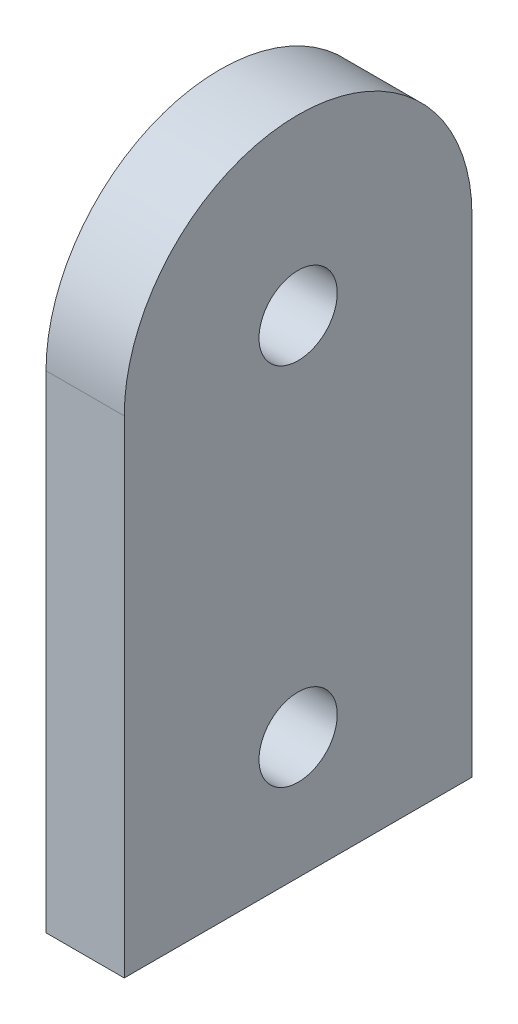
ISO-10303-21;
HEADER;
FILE_DESCRIPTION(('STEP AP214'),'2;1');
FILE_NAME('part.step','',(''),(''),'','','');
FILE_SCHEMA(('AUTOMOTIVE_DESIGN { 1 0 10303 214 1 1 1 1 }'));
ENDSEC;
DATA;
#1=APPLICATION_CONTEXT('core data for automotive mechanical design processes');
#2=APPLICATION_PROTOCOL_DEFINITION('international standard','automotive_design',2000,#1);
#3=PRODUCT_CONTEXT('',#1,'mechanical');
#4=PRODUCT('Part','Part','',(#3));
#5=PRODUCT_RELATED_PRODUCT_CATEGORY('part','',(#4));
#6=PRODUCT_DEFINITION_FORMATION('','',#4);
#7=PRODUCT_DEFINITION_CONTEXT('part definition',#1,'design');
#8=PRODUCT_DEFINITION('design','',#6,#7);
#9=PRODUCT_DEFINITION_SHAPE('','',#8);
#10=(LENGTH_UNIT() NAMED_UNIT(*) SI_UNIT(.MILLI.,.METRE.));
#11=(NAMED_UNIT(*) PLANE_ANGLE_UNIT() SI_UNIT($,.RADIAN.));
#12=(NAMED_UNIT(*) SI_UNIT($,.STERADIAN.) SOLID_ANGLE_UNIT());
#13=UNCERTAINTY_MEASURE_WITH_UNIT(LENGTH_MEASURE(1.E-05),#10,'distance_accuracy_value','');
#14=(GEOMETRIC_REPRESENTATION_CONTEXT(3) GLOBAL_UNCERTAINTY_ASSIGNED_CONTEXT((#13)) GLOBAL_UNIT_ASSIGNED_CONTEXT((#10,
#11,#12)) REPRESENTATION_CONTEXT('',''));
#15=CARTESIAN_POINT('',(0.,0.,0.));
#16=DIRECTION('',(0.,0.,1.));
#17=DIRECTION('',(1.,0.,0.));
#18=AXIS2_PLACEMENT_3D('',#15,#16,#17);
#19=CARTESIAN_POINT('',(4.5,28.,-10.));
#20=DIRECTION('',(1.,0.,0.));
#21=DIRECTION('',(0.,0.,-1.));
#22=AXIS2_PLACEMENT_3D('',#19,#20,#21);
#23=PLANE('',#22);
#24=CARTESIAN_POINT('',(4.5,28.,-10.));
#25=DIRECTION('',(1.,0.,0.));
#26=DIRECTION('',(0.,0.,-1.));
#27=AXIS2_PLACEMENT_3D('',#24,#25,#26);
#28=CIRCLE('',#27,2.25);
#29=CARTESIAN_POINT('',(4.5,28.,-12.25));
#30=VERTEX_POINT('',#29);
#31=EDGE_CURVE('E102',#30,#30,#28,.T.);
#32=ORIENTED_EDGE('',*,*,#31,.F.);
#33=EDGE_LOOP('',(#32));
#34=FACE_BOUND('',#33,.T.);
#35=DIRECTION('',(0.,-1.,0.));
#36=VECTOR('',#35,1.);
#37=CARTESIAN_POINT('',(4.5,0.,0.));
#38=LINE('',#37,#36);
#39=CARTESIAN_POINT('',(4.5,28.,0.));
#40=VERTEX_POINT('',#39);
#41=CARTESIAN_POINT('',(4.5,0.,0.));
#42=VERTEX_POINT('',#41);
#43=EDGE_CURVE('E87',#40,#42,#38,.T.);
#44=ORIENTED_EDGE('',*,*,#43,.T.);
#45=DIRECTION('',(0.,0.,-1.));
#46=VECTOR('',#45,1.);
#47=CARTESIAN_POINT('',(4.5,0.,0.));
#48=LINE('',#47,#46);
#49=CARTESIAN_POINT('',(4.5,0.,-20.));
#50=VERTEX_POINT('',#49);
#51=EDGE_CURVE('E82',#42,#50,#48,.T.);
#52=ORIENTED_EDGE('',*,*,#51,.T.);
#53=DIRECTION('',(0.,1.,0.));
#54=VECTOR('',#53,1.);
#55=CARTESIAN_POINT('',(4.5,0.,-20.));
#56=LINE('',#55,#54);
#57=CARTESIAN_POINT('',(4.5,28.,-20.));
#58=VERTEX_POINT('',#57);
#59=EDGE_CURVE('E85',#50,#58,#56,.T.);
#60=ORIENTED_EDGE('',*,*,#59,.T.);
#61=CARTESIAN_POINT('',(4.5,28.,-10.));
#62=DIRECTION('',(1.,0.,0.));
#63=DIRECTION('',(0.,0.,-1.));
#64=AXIS2_PLACEMENT_3D('',#61,#62,#63);
#65=CIRCLE('',#64,10.);
#66=EDGE_CURVE('E52',#58,#40,#65,.T.);
#67=ORIENTED_EDGE('',*,*,#66,.T.);
#68=EDGE_LOOP('',(#44,#52,#60,#67));
#69=FACE_BOUND('',#68,.T.);
#70=CARTESIAN_POINT('',(4.5,7.,-10.));
#71=DIRECTION('',(1.,0.,0.));
#72=DIRECTION('',(0.,0.,-1.));
#73=AXIS2_PLACEMENT_3D('',#70,#71,#72);
#74=CIRCLE('',#73,2.25);
#75=CARTESIAN_POINT('',(4.5,7.,-12.25));
#76=VERTEX_POINT('',#75);
#77=EDGE_CURVE('E117',#76,#76,#74,.T.);
#78=ORIENTED_EDGE('',*,*,#77,.F.);
#79=EDGE_LOOP('',(#78));
#80=FACE_BOUND('',#79,.T.);
#81=ADVANCED_FACE('F35',(#34,#69,#80),#23,.T.);
#82=CARTESIAN_POINT('',(0.,28.,-10.));
#83=DIRECTION('',(1.,0.,0.));
#84=DIRECTION('',(0.,0.,-1.));
#85=AXIS2_PLACEMENT_3D('',#82,#83,#84);
#86=PLANE('',#85);
#87=DIRECTION('',(0.,-1.,0.));
#88=VECTOR('',#87,1.);
#89=CARTESIAN_POINT('',(0.,0.,0.));
#90=LINE('',#89,#88);
#91=CARTESIAN_POINT('',(0.,28.,0.));
#92=VERTEX_POINT('',#91);
#93=CARTESIAN_POINT('',(0.,0.,0.));
#94=VERTEX_POINT('',#93);
#95=EDGE_CURVE('E99',#92,#94,#90,.T.);
#96=ORIENTED_EDGE('',*,*,#95,.F.);
#97=CARTESIAN_POINT('',(0.,28.,-10.));
#98=DIRECTION('',(1.,0.,0.));
#99=DIRECTION('',(0.,0.,-1.));
#100=AXIS2_PLACEMENT_3D('',#97,#98,#99);
#101=CIRCLE('',#100,10.);
#102=CARTESIAN_POINT('',(0.,28.,-20.));
#103=VERTEX_POINT('',#102);
#104=EDGE_CURVE('E75',#103,#92,#101,.T.);
#105=ORIENTED_EDGE('',*,*,#104,.F.);
#106=DIRECTION('',(0.,1.,0.));
#107=VECTOR('',#106,1.);
#108=CARTESIAN_POINT('',(0.,0.,-20.));
#109=LINE('',#108,#107);
#110=CARTESIAN_POINT('',(0.,0.,-20.));
#111=VERTEX_POINT('',#110);
#112=EDGE_CURVE('E69',#111,#103,#109,.T.);
#113=ORIENTED_EDGE('',*,*,#112,.F.);
#114=DIRECTION('',(0.,0.,-1.));
#115=VECTOR('',#114,1.);
#116=CARTESIAN_POINT('',(0.,0.,0.));
#117=LINE('',#116,#115);
#118=EDGE_CURVE('E91',#94,#111,#117,.T.);
#119=ORIENTED_EDGE('',*,*,#118,.F.);
#120=EDGE_LOOP('',(#96,#105,#113,#119));
#121=FACE_BOUND('',#120,.T.);
#122=CARTESIAN_POINT('',(0.,28.,-10.));
#123=DIRECTION('',(1.,0.,0.));
#124=DIRECTION('',(0.,0.,-1.));
#125=AXIS2_PLACEMENT_3D('',#122,#123,#124);
#126=CIRCLE('',#125,2.25);
#127=CARTESIAN_POINT('',(0.,28.,-12.25));
#128=VERTEX_POINT('',#127);
#129=EDGE_CURVE('E114',#128,#128,#126,.T.);
#130=ORIENTED_EDGE('',*,*,#129,.T.);
#131=EDGE_LOOP('',(#130));
#132=FACE_BOUND('',#131,.T.);
#133=CARTESIAN_POINT('',(0.,7.,-10.));
#134=DIRECTION('',(1.,0.,0.));
#135=DIRECTION('',(0.,0.,-1.));
#136=AXIS2_PLACEMENT_3D('',#133,#134,#135);
#137=CIRCLE('',#136,2.25);
#138=CARTESIAN_POINT('',(0.,7.,-12.25));
#139=VERTEX_POINT('',#138);
#140=EDGE_CURVE('E120',#139,#139,#137,.T.);
#141=ORIENTED_EDGE('',*,*,#140,.T.);
#142=EDGE_LOOP('',(#141));
#143=FACE_BOUND('',#142,.T.);
#144=ADVANCED_FACE('F110',(#121,#132,#143),#86,.F.);
#145=CARTESIAN_POINT('',(4.5,0.,0.));
#146=DIRECTION('',(0.,0.,-1.));
#147=DIRECTION('',(-1.,0.,0.));
#148=AXIS2_PLACEMENT_3D('',#145,#146,#147);
#149=PLANE('',#148);
#150=ORIENTED_EDGE('',*,*,#95,.T.);
#151=DIRECTION('',(-1.,0.,0.));
#152=VECTOR('',#151,1.);
#153=CARTESIAN_POINT('',(4.5,0.,0.));
#154=LINE('',#153,#152);
#155=EDGE_CURVE('E11',#42,#94,#154,.T.);
#156=ORIENTED_EDGE('',*,*,#155,.F.);
#157=ORIENTED_EDGE('',*,*,#43,.F.);
#158=DIRECTION('',(-1.,0.,0.));
#159=VECTOR('',#158,1.);
#160=CARTESIAN_POINT('',(4.5,28.,0.));
#161=LINE('',#160,#159);
#162=EDGE_CURVE('E95',#40,#92,#161,.T.);
#163=ORIENTED_EDGE('',*,*,#162,.T.);
#164=EDGE_LOOP('',(#150,#156,#157,#163));
#165=FACE_BOUND('',#164,.T.);
#166=ADVANCED_FACE('F37',(#165),#149,.F.);
#167=CARTESIAN_POINT('',(4.5,0.,0.));
#168=DIRECTION('',(0.,1.,0.));
#169=DIRECTION('',(0.,0.,1.));
#170=AXIS2_PLACEMENT_3D('',#167,#168,#169);
#171=PLANE('',#170);
#172=ORIENTED_EDGE('',*,*,#118,.T.);
#173=DIRECTION('',(-1.,0.,0.));
#174=VECTOR('',#173,1.);
#175=CARTESIAN_POINT('',(4.5,0.,-20.));
#176=LINE('',#175,#174);
#177=EDGE_CURVE('E44',#50,#111,#176,.T.);
#178=ORIENTED_EDGE('',*,*,#177,.F.);
#179=ORIENTED_EDGE('',*,*,#51,.F.);
#180=ORIENTED_EDGE('',*,*,#155,.T.);
#181=EDGE_LOOP('',(#172,#178,#179,#180));
#182=FACE_BOUND('',#181,.T.);
#183=ADVANCED_FACE('F90',(#182),#171,.F.);
#184=CARTESIAN_POINT('',(4.5,0.,-20.));
#185=DIRECTION('',(0.,0.,1.));
#186=DIRECTION('',(1.,0.,0.));
#187=AXIS2_PLACEMENT_3D('',#184,#185,#186);
#188=PLANE('',#187);
#189=ORIENTED_EDGE('',*,*,#112,.T.);
#190=DIRECTION('',(-1.,0.,0.));
#191=VECTOR('',#190,1.);
#192=CARTESIAN_POINT('',(4.5,28.,-20.));
#193=LINE('',#192,#191);
#194=EDGE_CURVE('E92',#58,#103,#193,.T.);
#195=ORIENTED_EDGE('',*,*,#194,.F.);
#196=ORIENTED_EDGE('',*,*,#59,.F.);
#197=ORIENTED_EDGE('',*,*,#177,.T.);
#198=EDGE_LOOP('',(#189,#195,#196,#197));
#199=FACE_BOUND('',#198,.T.);
#200=ADVANCED_FACE('F93',(#199),#188,.F.);
#201=CARTESIAN_POINT('',(4.5,28.,-10.));
#202=DIRECTION('',(-1.,0.,0.));
#203=DIRECTION('',(0.,0.,1.));
#204=AXIS2_PLACEMENT_3D('',#201,#202,#203);
#205=CYLINDRICAL_SURFACE('',#204,10.);
#206=ORIENTED_EDGE('',*,*,#104,.T.);
#207=ORIENTED_EDGE('',*,*,#162,.F.);
#208=ORIENTED_EDGE('',*,*,#66,.F.);
#209=ORIENTED_EDGE('',*,*,#194,.T.);
#210=EDGE_LOOP('',(#206,#207,#208,#209));
#211=FACE_BOUND('',#210,.T.);
#212=ADVANCED_FACE('F107',(#211),#205,.T.);
#213=CARTESIAN_POINT('',(4.5,28.,-10.));
#214=DIRECTION('',(-1.,0.,0.));
#215=DIRECTION('',(0.,0.,1.));
#216=AXIS2_PLACEMENT_3D('',#213,#214,#215);
#217=CYLINDRICAL_SURFACE('',#216,2.25);
#218=ORIENTED_EDGE('',*,*,#31,.T.);
#219=EDGE_LOOP('',(#218));
#220=FACE_BOUND('',#219,.T.);
#221=ORIENTED_EDGE('',*,*,#129,.F.);
#222=EDGE_LOOP('',(#221));
#223=FACE_BOUND('',#222,.T.);
#224=ADVANCED_FACE('F137',(#220,#223),#217,.F.);
#225=CARTESIAN_POINT('',(4.5,7.,-10.));
#226=DIRECTION('',(-1.,0.,0.));
#227=DIRECTION('',(0.,0.,1.));
#228=AXIS2_PLACEMENT_3D('',#225,#226,#227);
#229=CYLINDRICAL_SURFACE('',#228,2.25);
#230=ORIENTED_EDGE('',*,*,#77,.T.);
#231=EDGE_LOOP('',(#230));
#232=FACE_BOUND('',#231,.T.);
#233=ORIENTED_EDGE('',*,*,#140,.F.);
#234=EDGE_LOOP('',(#233));
#235=FACE_BOUND('',#234,.T.);
#236=ADVANCED_FACE('F126',(#232,#235),#229,.F.);
#237=CLOSED_SHELL('',(#81,#144,#166,#183,#200,#212,#224,#236));
#238=MANIFOLD_SOLID_BREP('B2',#237);
#239=ADVANCED_BREP_SHAPE_REPRESENTATION('',(#18,#238),#14);
#240=SHAPE_DEFINITION_REPRESENTATION(#9,#239);
ENDSEC;
END-ISO-10303-21;
